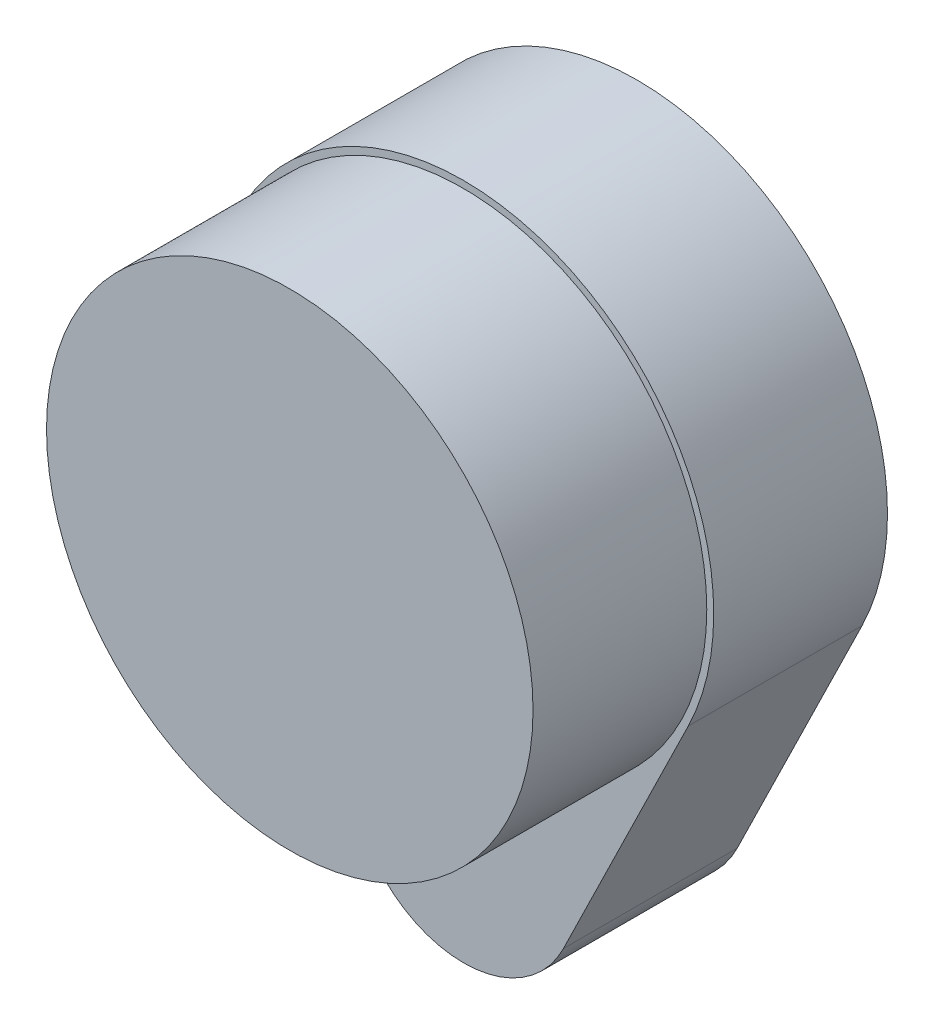
ISO-10303-21;
HEADER;
FILE_DESCRIPTION(('STEP AP214'),'2;1');
FILE_NAME('part.step','',(''),(''),'','','');
FILE_SCHEMA(('AUTOMOTIVE_DESIGN { 1 0 10303 214 1 1 1 1 }'));
ENDSEC;
DATA;
#1=APPLICATION_CONTEXT('core data for automotive mechanical design processes');
#2=APPLICATION_PROTOCOL_DEFINITION('international standard','automotive_design',2000,#1);
#3=PRODUCT_CONTEXT('',#1,'mechanical');
#4=PRODUCT('Part','Part','',(#3));
#5=PRODUCT_RELATED_PRODUCT_CATEGORY('part','',(#4));
#6=PRODUCT_DEFINITION_FORMATION('','',#4);
#7=PRODUCT_DEFINITION_CONTEXT('part definition',#1,'design');
#8=PRODUCT_DEFINITION('design','',#6,#7);
#9=PRODUCT_DEFINITION_SHAPE('','',#8);
#10=(LENGTH_UNIT() NAMED_UNIT(*) SI_UNIT(.MILLI.,.METRE.));
#11=(NAMED_UNIT(*) PLANE_ANGLE_UNIT() SI_UNIT($,.RADIAN.));
#12=(NAMED_UNIT(*) SI_UNIT($,.STERADIAN.) SOLID_ANGLE_UNIT());
#13=UNCERTAINTY_MEASURE_WITH_UNIT(LENGTH_MEASURE(1.E-05),#10,'distance_accuracy_value','');
#14=(GEOMETRIC_REPRESENTATION_CONTEXT(3) GLOBAL_UNCERTAINTY_ASSIGNED_CONTEXT((#13)) GLOBAL_UNIT_ASSIGNED_CONTEXT((#10,
#11,#12)) REPRESENTATION_CONTEXT('',''));
#15=CARTESIAN_POINT('',(0.,0.,0.));
#16=DIRECTION('',(0.,0.,1.));
#17=DIRECTION('',(1.,0.,0.));
#18=AXIS2_PLACEMENT_3D('',#15,#16,#17);
#19=CARTESIAN_POINT('',(0.,-37.,-5.));
#20=DIRECTION('',(0.,0.,1.));
#21=DIRECTION('',(1.,0.,0.));
#22=AXIS2_PLACEMENT_3D('',#19,#20,#21);
#23=CYLINDRICAL_SURFACE('',#22,16.);
#24=CARTESIAN_POINT('',(0.,-37.,20.));
#25=DIRECTION('',(0.,0.,1.));
#26=DIRECTION('',(1.,0.,0.));
#27=AXIS2_PLACEMENT_3D('',#24,#25,#26);
#28=CIRCLE('',#27,16.);
#29=CARTESIAN_POINT('',(-14.3714082369543,-44.032967032967,20.));
#30=VERTEX_POINT('',#29);
#31=CARTESIAN_POINT('',(14.3714082369543,-44.032967032967,20.));
#32=VERTEX_POINT('',#31);
#33=EDGE_CURVE('E99',#30,#32,#28,.T.);
#34=ORIENTED_EDGE('',*,*,#33,.F.);
#35=DIRECTION('',(0.,0.,1.));
#36=VECTOR('',#35,1.);
#37=CARTESIAN_POINT('',(-14.3714082369543,-44.032967032967,-5.));
#38=LINE('',#37,#36);
#39=CARTESIAN_POINT('',(-14.3714082369543,-44.032967032967,-5.));
#40=VERTEX_POINT('',#39);
#41=EDGE_CURVE('E40',#40,#30,#38,.T.);
#42=ORIENTED_EDGE('',*,*,#41,.F.);
#43=CARTESIAN_POINT('',(0.,-37.,-5.));
#44=DIRECTION('',(0.,0.,1.));
#45=DIRECTION('',(1.,0.,0.));
#46=AXIS2_PLACEMENT_3D('',#43,#44,#45);
#47=CIRCLE('',#46,16.);
#48=CARTESIAN_POINT('',(14.3714082369543,-44.032967032967,-5.));
#49=VERTEX_POINT('',#48);
#50=EDGE_CURVE('E92',#40,#49,#47,.T.);
#51=ORIENTED_EDGE('',*,*,#50,.T.);
#52=DIRECTION('',(0.,0.,1.));
#53=VECTOR('',#52,1.);
#54=CARTESIAN_POINT('',(14.3714082369543,-44.032967032967,-5.));
#55=LINE('',#54,#53);
#56=EDGE_CURVE('E75',#49,#32,#55,.T.);
#57=ORIENTED_EDGE('',*,*,#56,.T.);
#58=EDGE_LOOP('',(#34,#42,#51,#57));
#59=FACE_BOUND('',#58,.T.);
#60=ADVANCED_FACE('F32',(#59),#23,.T.);
#61=CARTESIAN_POINT('',(-32.3356685331472,-7.3241758241758,-5.));
#62=DIRECTION('',(-0.898213014809646,-0.43956043956044,0.));
#63=DIRECTION('',(0.43956043956044,-0.898213014809646,0.));
#64=AXIS2_PLACEMENT_3D('',#61,#62,#63);
#65=PLANE('',#64);
#66=DIRECTION('',(0.43956043956044,-0.898213014809646,0.));
#67=VECTOR('',#66,1.);
#68=CARTESIAN_POINT('',(-32.3356685331472,-7.3241758241758,20.));
#69=LINE('',#68,#67);
#70=CARTESIAN_POINT('',(-32.3356685331473,-7.32417582417579,20.));
#71=VERTEX_POINT('',#70);
#72=EDGE_CURVE('E94',#71,#30,#69,.T.);
#73=ORIENTED_EDGE('',*,*,#72,.F.);
#74=DIRECTION('',(0.,0.,1.));
#75=VECTOR('',#74,1.);
#76=CARTESIAN_POINT('',(-32.3356685331473,-7.32417582417579,-5.));
#77=LINE('',#76,#75);
#78=CARTESIAN_POINT('',(-32.3356685331473,-7.32417582417579,-5.));
#79=VERTEX_POINT('',#78);
#80=EDGE_CURVE('E64',#79,#71,#77,.T.);
#81=ORIENTED_EDGE('',*,*,#80,.F.);
#82=DIRECTION('',(0.43956043956044,-0.898213014809646,0.));
#83=VECTOR('',#82,1.);
#84=CARTESIAN_POINT('',(-32.3356685331472,-7.3241758241758,-5.));
#85=LINE('',#84,#83);
#86=EDGE_CURVE('E89',#79,#40,#85,.T.);
#87=ORIENTED_EDGE('',*,*,#86,.T.);
#88=ORIENTED_EDGE('',*,*,#41,.T.);
#89=EDGE_LOOP('',(#73,#81,#87,#88));
#90=FACE_BOUND('',#89,.T.);
#91=ADVANCED_FACE('F111',(#90),#65,.T.);
#92=CARTESIAN_POINT('',(0.,8.50000000000001,-5.));
#93=DIRECTION('',(0.,0.,1.));
#94=DIRECTION('',(1.,0.,0.));
#95=AXIS2_PLACEMENT_3D('',#92,#93,#94);
#96=CYLINDRICAL_SURFACE('',#95,36.);
#97=CARTESIAN_POINT('',(0.,8.50000000000001,20.));
#98=DIRECTION('',(0.,0.,1.));
#99=DIRECTION('',(1.,0.,0.));
#100=AXIS2_PLACEMENT_3D('',#97,#98,#99);
#101=CIRCLE('',#100,36.);
#102=CARTESIAN_POINT('',(32.3356685331473,-7.3241758241758,20.));
#103=VERTEX_POINT('',#102);
#104=EDGE_CURVE('E83',#103,#71,#101,.T.);
#105=ORIENTED_EDGE('',*,*,#104,.F.);
#106=DIRECTION('',(0.,0.,1.));
#107=VECTOR('',#106,1.);
#108=CARTESIAN_POINT('',(32.3356685331473,-7.3241758241758,-5.));
#109=LINE('',#108,#107);
#110=CARTESIAN_POINT('',(32.3356685331473,-7.3241758241758,-5.));
#111=VERTEX_POINT('',#110);
#112=EDGE_CURVE('E78',#111,#103,#109,.T.);
#113=ORIENTED_EDGE('',*,*,#112,.F.);
#114=CARTESIAN_POINT('',(0.,8.50000000000001,-5.));
#115=DIRECTION('',(0.,0.,1.));
#116=DIRECTION('',(1.,0.,0.));
#117=AXIS2_PLACEMENT_3D('',#114,#115,#116);
#118=CIRCLE('',#117,36.);
#119=EDGE_CURVE('E81',#111,#79,#118,.T.);
#120=ORIENTED_EDGE('',*,*,#119,.T.);
#121=ORIENTED_EDGE('',*,*,#80,.T.);
#122=EDGE_LOOP('',(#105,#113,#120,#121));
#123=FACE_BOUND('',#122,.T.);
#124=ADVANCED_FACE('F80',(#123),#96,.T.);
#125=CARTESIAN_POINT('',(14.3714082369543,-44.032967032967,-5.));
#126=DIRECTION('',(0.898213014809646,-0.439560439560439,0.));
#127=DIRECTION('',(0.439560439560439,0.898213014809646,0.));
#128=AXIS2_PLACEMENT_3D('',#125,#126,#127);
#129=PLANE('',#128);
#130=DIRECTION('',(0.439560439560439,0.898213014809646,0.));
#131=VECTOR('',#130,1.);
#132=CARTESIAN_POINT('',(14.3714082369543,-44.032967032967,20.));
#133=LINE('',#132,#131);
#134=EDGE_CURVE('E102',#32,#103,#133,.T.);
#135=ORIENTED_EDGE('',*,*,#134,.F.);
#136=ORIENTED_EDGE('',*,*,#56,.F.);
#137=DIRECTION('',(0.439560439560439,0.898213014809646,0.));
#138=VECTOR('',#137,1.);
#139=CARTESIAN_POINT('',(14.3714082369543,-44.032967032967,-5.));
#140=LINE('',#139,#138);
#141=EDGE_CURVE('E88',#49,#111,#140,.T.);
#142=ORIENTED_EDGE('',*,*,#141,.T.);
#143=ORIENTED_EDGE('',*,*,#112,.T.);
#144=EDGE_LOOP('',(#135,#136,#142,#143));
#145=FACE_BOUND('',#144,.T.);
#146=ADVANCED_FACE('F91',(#145),#129,.T.);
#147=CARTESIAN_POINT('',(0.,-37.,-5.));
#148=DIRECTION('',(0.,0.,1.));
#149=DIRECTION('',(1.,0.,0.));
#150=AXIS2_PLACEMENT_3D('',#147,#148,#149);
#151=PLANE('',#150);
#152=CARTESIAN_POINT('',(0.,0.,-5.));
#153=DIRECTION('',(0.,0.,-1.));
#154=DIRECTION('',(-1.,0.,0.));
#155=AXIS2_PLACEMENT_3D('',#152,#153,#154);
#156=CIRCLE('',#155,1.49999999999999);
#157=CARTESIAN_POINT('',(-1.49999999999999,0.,-5.));
#158=VERTEX_POINT('',#157);
#159=EDGE_CURVE('E163',#158,#158,#156,.T.);
#160=ORIENTED_EDGE('',*,*,#159,.F.);
#161=EDGE_LOOP('',(#160));
#162=FACE_BOUND('',#161,.T.);
#163=CARTESIAN_POINT('',(0.,-37.,-5.));
#164=DIRECTION('',(0.,0.,-1.));
#165=DIRECTION('',(-1.,0.,0.));
#166=AXIS2_PLACEMENT_3D('',#163,#164,#165);
#167=CIRCLE('',#166,1.49999999999999);
#168=CARTESIAN_POINT('',(-1.49999999999999,-37.,-5.));
#169=VERTEX_POINT('',#168);
#170=EDGE_CURVE('E165',#169,#169,#167,.T.);
#171=ORIENTED_EDGE('',*,*,#170,.F.);
#172=EDGE_LOOP('',(#171));
#173=FACE_BOUND('',#172,.T.);
#174=ORIENTED_EDGE('',*,*,#50,.F.);
#175=ORIENTED_EDGE('',*,*,#86,.F.);
#176=ORIENTED_EDGE('',*,*,#119,.F.);
#177=ORIENTED_EDGE('',*,*,#141,.F.);
#178=EDGE_LOOP('',(#174,#175,#176,#177));
#179=FACE_BOUND('',#178,.T.);
#180=ADVANCED_FACE('F87',(#162,#173,#179),#151,.F.);
#181=CARTESIAN_POINT('',(0.,-37.,20.));
#182=DIRECTION('',(0.,0.,1.));
#183=DIRECTION('',(1.,0.,0.));
#184=AXIS2_PLACEMENT_3D('',#181,#182,#183);
#185=PLANE('',#184);
#186=CARTESIAN_POINT('',(0.,8.50000000000001,20.));
#187=DIRECTION('',(0.,0.,1.));
#188=DIRECTION('',(1.,0.,0.));
#189=AXIS2_PLACEMENT_3D('',#186,#187,#188);
#190=CIRCLE('',#189,35.);
#191=CARTESIAN_POINT('',(35.,8.50000000000001,20.));
#192=VERTEX_POINT('',#191);
#193=EDGE_CURVE('E11',#192,#192,#190,.T.);
#194=ORIENTED_EDGE('',*,*,#193,.F.);
#195=EDGE_LOOP('',(#194));
#196=FACE_BOUND('',#195,.T.);
#197=ORIENTED_EDGE('',*,*,#33,.T.);
#198=ORIENTED_EDGE('',*,*,#134,.T.);
#199=ORIENTED_EDGE('',*,*,#104,.T.);
#200=ORIENTED_EDGE('',*,*,#72,.T.);
#201=EDGE_LOOP('',(#197,#198,#199,#200));
#202=FACE_BOUND('',#201,.T.);
#203=ADVANCED_FACE('F110',(#196,#202),#185,.T.);
#204=CARTESIAN_POINT('',(0.,8.50000000000001,45.));
#205=DIRECTION('',(0.,0.,-1.));
#206=DIRECTION('',(-1.,0.,0.));
#207=AXIS2_PLACEMENT_3D('',#204,#205,#206);
#208=CYLINDRICAL_SURFACE('',#207,35.);
#209=CARTESIAN_POINT('',(0.,8.50000000000001,45.));
#210=DIRECTION('',(0.,0.,-1.));
#211=DIRECTION('',(1.,0.,0.));
#212=AXIS2_PLACEMENT_3D('',#209,#210,#211);
#213=CIRCLE('',#212,35.);
#214=CARTESIAN_POINT('',(35.,8.50000000000001,45.));
#215=VERTEX_POINT('',#214);
#216=EDGE_CURVE('E103',#215,#215,#213,.T.);
#217=ORIENTED_EDGE('',*,*,#216,.T.);
#218=EDGE_LOOP('',(#217));
#219=FACE_BOUND('',#218,.T.);
#220=ORIENTED_EDGE('',*,*,#193,.T.);
#221=EDGE_LOOP('',(#220));
#222=FACE_BOUND('',#221,.T.);
#223=ADVANCED_FACE('F129',(#219,#222),#208,.T.);
#224=CARTESIAN_POINT('',(0.,8.50000000000001,45.));
#225=DIRECTION('',(0.,0.,1.));
#226=DIRECTION('',(1.,0.,0.));
#227=AXIS2_PLACEMENT_3D('',#224,#225,#226);
#228=PLANE('',#227);
#229=ORIENTED_EDGE('',*,*,#216,.F.);
#230=EDGE_LOOP('',(#229));
#231=FACE_BOUND('',#230,.T.);
#232=ADVANCED_FACE('F136',(#231),#228,.T.);
#233=CARTESIAN_POINT('',(0.,-37.,0.));
#234=DIRECTION('',(0.,0.,1.));
#235=DIRECTION('',(1.,0.,0.));
#236=AXIS2_PLACEMENT_3D('',#233,#234,#235);
#237=PLANE('',#236);
#238=CARTESIAN_POINT('',(0.,-37.,0.));
#239=DIRECTION('',(0.,0.,-1.));
#240=DIRECTION('',(-1.,0.,0.));
#241=AXIS2_PLACEMENT_3D('',#238,#239,#240);
#242=CIRCLE('',#241,1.49999999999999);
#243=CARTESIAN_POINT('',(-1.49999999999999,-37.,0.));
#244=VERTEX_POINT('',#243);
#245=EDGE_CURVE('E170',#244,#244,#242,.T.);
#246=ORIENTED_EDGE('',*,*,#245,.T.);
#247=EDGE_LOOP('',(#246));
#248=FACE_BOUND('',#247,.T.);
#249=ADVANCED_FACE('F140',(#248),#237,.F.);
#250=CARTESIAN_POINT('',(0.,-37.,-5.));
#251=DIRECTION('',(0.,0.,-1.));
#252=DIRECTION('',(-1.,0.,0.));
#253=AXIS2_PLACEMENT_3D('',#250,#251,#252);
#254=CYLINDRICAL_SURFACE('',#253,1.49999999999999);
#255=ORIENTED_EDGE('',*,*,#245,.F.);
#256=EDGE_LOOP('',(#255));
#257=FACE_BOUND('',#256,.T.);
#258=ORIENTED_EDGE('',*,*,#170,.T.);
#259=EDGE_LOOP('',(#258));
#260=FACE_BOUND('',#259,.T.);
#261=ADVANCED_FACE('F144',(#257,#260),#254,.F.);
#262=CARTESIAN_POINT('',(0.,0.,0.));
#263=DIRECTION('',(0.,0.,1.));
#264=DIRECTION('',(1.,0.,0.));
#265=AXIS2_PLACEMENT_3D('',#262,#263,#264);
#266=PLANE('',#265);
#267=CARTESIAN_POINT('',(0.,0.,0.));
#268=DIRECTION('',(0.,0.,-1.));
#269=DIRECTION('',(-1.,0.,0.));
#270=AXIS2_PLACEMENT_3D('',#267,#268,#269);
#271=CIRCLE('',#270,1.49999999999999);
#272=CARTESIAN_POINT('',(-1.49999999999999,0.,0.));
#273=VERTEX_POINT('',#272);
#274=EDGE_CURVE('E161',#273,#273,#271,.T.);
#275=ORIENTED_EDGE('',*,*,#274,.T.);
#276=EDGE_LOOP('',(#275));
#277=FACE_BOUND('',#276,.T.);
#278=ADVANCED_FACE('F148',(#277),#266,.F.);
#279=CARTESIAN_POINT('',(0.,0.,-5.));
#280=DIRECTION('',(0.,0.,-1.));
#281=DIRECTION('',(-1.,0.,0.));
#282=AXIS2_PLACEMENT_3D('',#279,#280,#281);
#283=CYLINDRICAL_SURFACE('',#282,1.49999999999999);
#284=ORIENTED_EDGE('',*,*,#274,.F.);
#285=EDGE_LOOP('',(#284));
#286=FACE_BOUND('',#285,.T.);
#287=ORIENTED_EDGE('',*,*,#159,.T.);
#288=EDGE_LOOP('',(#287));
#289=FACE_BOUND('',#288,.T.);
#290=ADVANCED_FACE('F152',(#286,#289),#283,.F.);
#291=CLOSED_SHELL('',(#60,#91,#124,#146,#180,#203,#223,#232,#249,#261,#278,#290));
#292=MANIFOLD_SOLID_BREP('B2',#291);
#293=ADVANCED_BREP_SHAPE_REPRESENTATION('',(#18,#292),#14);
#294=SHAPE_DEFINITION_REPRESENTATION(#9,#293);
ENDSEC;
END-ISO-10303-21;
